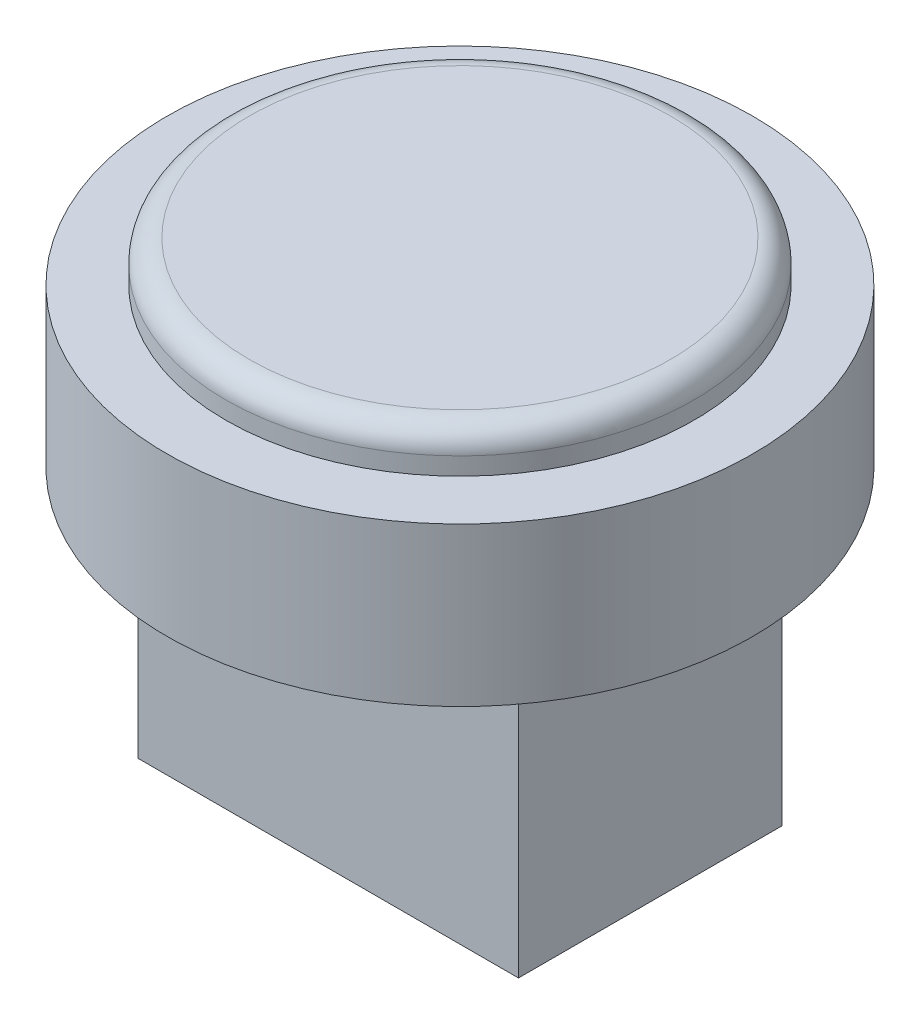
ISO-10303-21;
HEADER;
FILE_DESCRIPTION(('STEP AP214'),'2;1');
FILE_NAME('part.step','',(''),(''),'','','');
FILE_SCHEMA(('AUTOMOTIVE_DESIGN { 1 0 10303 214 1 1 1 1 }'));
ENDSEC;
DATA;
#1=APPLICATION_CONTEXT('core data for automotive mechanical design processes');
#2=APPLICATION_PROTOCOL_DEFINITION('international standard','automotive_design',2000,#1);
#3=PRODUCT_CONTEXT('',#1,'mechanical');
#4=PRODUCT('Part','Part','',(#3));
#5=PRODUCT_RELATED_PRODUCT_CATEGORY('part','',(#4));
#6=PRODUCT_DEFINITION_FORMATION('','',#4);
#7=PRODUCT_DEFINITION_CONTEXT('part definition',#1,'design');
#8=PRODUCT_DEFINITION('design','',#6,#7);
#9=PRODUCT_DEFINITION_SHAPE('','',#8);
#10=(LENGTH_UNIT() NAMED_UNIT(*) SI_UNIT(.MILLI.,.METRE.));
#11=(NAMED_UNIT(*) PLANE_ANGLE_UNIT() SI_UNIT($,.RADIAN.));
#12=(NAMED_UNIT(*) SI_UNIT($,.STERADIAN.) SOLID_ANGLE_UNIT());
#13=UNCERTAINTY_MEASURE_WITH_UNIT(LENGTH_MEASURE(1.E-05),#10,'distance_accuracy_value','');
#14=(GEOMETRIC_REPRESENTATION_CONTEXT(3) GLOBAL_UNCERTAINTY_ASSIGNED_CONTEXT((#13)) GLOBAL_UNIT_ASSIGNED_CONTEXT((#10,
#11,#12)) REPRESENTATION_CONTEXT('',''));
#15=CARTESIAN_POINT('',(0.,0.,0.));
#16=DIRECTION('',(0.,0.,1.));
#17=DIRECTION('',(1.,0.,0.));
#18=AXIS2_PLACEMENT_3D('',#15,#16,#17);
#19=CARTESIAN_POINT('',(0.,0.,0.));
#20=DIRECTION('',(0.,1.,0.));
#21=DIRECTION('',(0.,0.,1.));
#22=AXIS2_PLACEMENT_3D('',#19,#20,#21);
#23=PLANE('',#22);
#24=CARTESIAN_POINT('',(0.,0.,0.));
#25=DIRECTION('',(0.,1.,0.));
#26=DIRECTION('',(0.,0.,1.));
#27=AXIS2_PLACEMENT_3D('',#24,#25,#26);
#28=CIRCLE('',#27,5.);
#29=CARTESIAN_POINT('',(0.,0.,-5.));
#30=VERTEX_POINT('',#29);
#31=EDGE_CURVE('E100',#30,#30,#28,.T.);
#32=ORIENTED_EDGE('',*,*,#31,.F.);
#33=EDGE_LOOP('',(#32));
#34=FACE_BOUND('',#33,.T.);
#35=DIRECTION('',(0.,0.,-1.));
#36=VECTOR('',#35,1.);
#37=CARTESIAN_POINT('',(-3.25,0.,2.25));
#38=LINE('',#37,#36);
#39=CARTESIAN_POINT('',(-3.25,0.,2.25));
#40=VERTEX_POINT('',#39);
#41=CARTESIAN_POINT('',(-3.25,0.,-2.25));
#42=VERTEX_POINT('',#41);
#43=EDGE_CURVE('E96',#40,#42,#38,.T.);
#44=ORIENTED_EDGE('',*,*,#43,.F.);
#45=DIRECTION('',(-1.,0.,0.));
#46=VECTOR('',#45,1.);
#47=CARTESIAN_POINT('',(-3.25,0.,2.25));
#48=LINE('',#47,#46);
#49=CARTESIAN_POINT('',(3.25,0.,2.25));
#50=VERTEX_POINT('',#49);
#51=EDGE_CURVE('E93',#50,#40,#48,.T.);
#52=ORIENTED_EDGE('',*,*,#51,.F.);
#53=DIRECTION('',(0.,0.,1.));
#54=VECTOR('',#53,1.);
#55=CARTESIAN_POINT('',(3.25,0.,2.25));
#56=LINE('',#55,#54);
#57=CARTESIAN_POINT('',(3.25,0.,-2.25));
#58=VERTEX_POINT('',#57);
#59=EDGE_CURVE('E55',#58,#50,#56,.T.);
#60=ORIENTED_EDGE('',*,*,#59,.F.);
#61=DIRECTION('',(1.,0.,0.));
#62=VECTOR('',#61,1.);
#63=CARTESIAN_POINT('',(-3.25,0.,-2.25));
#64=LINE('',#63,#62);
#65=EDGE_CURVE('E50',#42,#58,#64,.T.);
#66=ORIENTED_EDGE('',*,*,#65,.F.);
#67=EDGE_LOOP('',(#44,#52,#60,#66));
#68=FACE_BOUND('',#67,.T.);
#69=ADVANCED_FACE('F35',(#34,#68),#23,.F.);
#70=CARTESIAN_POINT('',(0.,2.7,0.));
#71=DIRECTION('',(0.,1.,0.));
#72=DIRECTION('',(0.,0.,1.));
#73=AXIS2_PLACEMENT_3D('',#70,#71,#72);
#74=PLANE('',#73);
#75=CARTESIAN_POINT('',(0.,2.7,0.));
#76=DIRECTION('',(0.,1.,0.));
#77=DIRECTION('',(0.,0.,1.));
#78=AXIS2_PLACEMENT_3D('',#75,#76,#77);
#79=CIRCLE('',#78,5.);
#80=CARTESIAN_POINT('',(0.,2.7,-5.));
#81=VERTEX_POINT('',#80);
#82=EDGE_CURVE('E106',#81,#81,#79,.T.);
#83=ORIENTED_EDGE('',*,*,#82,.T.);
#84=EDGE_LOOP('',(#83));
#85=FACE_BOUND('',#84,.T.);
#86=CARTESIAN_POINT('',(0.,2.7,0.));
#87=DIRECTION('',(0.,1.,0.));
#88=DIRECTION('',(0.,0.,1.));
#89=AXIS2_PLACEMENT_3D('',#86,#87,#88);
#90=CIRCLE('',#89,4.);
#91=CARTESIAN_POINT('',(0.,2.7,4.));
#92=VERTEX_POINT('',#91);
#93=EDGE_CURVE('E97',#92,#92,#90,.T.);
#94=ORIENTED_EDGE('',*,*,#93,.F.);
#95=EDGE_LOOP('',(#94));
#96=FACE_BOUND('',#95,.T.);
#97=ADVANCED_FACE('F126',(#85,#96),#74,.T.);
#98=CARTESIAN_POINT('',(0.,2.7,0.));
#99=DIRECTION('',(0.,-1.,0.));
#100=DIRECTION('',(0.,0.,-1.));
#101=AXIS2_PLACEMENT_3D('',#98,#99,#100);
#102=CYLINDRICAL_SURFACE('',#101,5.);
#103=CARTESIAN_POINT('',(0.,2.7,-5.));
#104=CARTESIAN_POINT('',(0.,2.671875,-5.));
#105=CARTESIAN_POINT('',(0.,2.64375,-5.));
#106=CARTESIAN_POINT('',(0.,2.5875,-5.));
#107=CARTESIAN_POINT('',(0.,2.559375,-5.));
#108=CARTESIAN_POINT('',(0.,2.503125,-5.));
#109=CARTESIAN_POINT('',(0.,2.475,-5.));
#110=CARTESIAN_POINT('',(0.,2.41875,-5.));
#111=CARTESIAN_POINT('',(0.,2.390625,-5.));
#112=CARTESIAN_POINT('',(0.,2.334375,-5.));
#113=CARTESIAN_POINT('',(0.,2.30625,-5.));
#114=CARTESIAN_POINT('',(0.,2.25,-5.));
#115=CARTESIAN_POINT('',(0.,2.221875,-5.));
#116=CARTESIAN_POINT('',(0.,2.165625,-5.));
#117=CARTESIAN_POINT('',(0.,2.1375,-5.));
#118=CARTESIAN_POINT('',(0.,2.08125,-5.));
#119=CARTESIAN_POINT('',(0.,2.053125,-5.));
#120=CARTESIAN_POINT('',(0.,1.996875,-5.));
#121=CARTESIAN_POINT('',(0.,1.96875,-5.));
#122=CARTESIAN_POINT('',(0.,1.9125,-5.));
#123=CARTESIAN_POINT('',(0.,1.884375,-5.));
#124=CARTESIAN_POINT('',(0.,1.828125,-5.));
#125=CARTESIAN_POINT('',(0.,1.8,-5.));
#126=CARTESIAN_POINT('',(0.,1.74375,-5.));
#127=CARTESIAN_POINT('',(0.,1.715625,-5.));
#128=CARTESIAN_POINT('',(0.,1.659375,-5.));
#129=CARTESIAN_POINT('',(0.,1.63125,-5.));
#130=CARTESIAN_POINT('',(0.,1.575,-5.));
#131=CARTESIAN_POINT('',(0.,1.546875,-5.));
#132=CARTESIAN_POINT('',(0.,1.490625,-5.));
#133=CARTESIAN_POINT('',(0.,1.4625,-5.));
#134=CARTESIAN_POINT('',(0.,1.40625,-5.));
#135=CARTESIAN_POINT('',(0.,1.378125,-5.));
#136=CARTESIAN_POINT('',(0.,1.321875,-5.));
#137=CARTESIAN_POINT('',(0.,1.29375,-5.));
#138=CARTESIAN_POINT('',(0.,1.2375,-5.));
#139=CARTESIAN_POINT('',(0.,1.209375,-5.));
#140=CARTESIAN_POINT('',(0.,1.153125,-5.));
#141=CARTESIAN_POINT('',(0.,1.125,-5.));
#142=CARTESIAN_POINT('',(0.,1.06875,-5.));
#143=CARTESIAN_POINT('',(0.,1.040625,-5.));
#144=CARTESIAN_POINT('',(0.,0.984375,-5.));
#145=CARTESIAN_POINT('',(0.,0.95625,-5.));
#146=CARTESIAN_POINT('',(0.,0.9,-5.));
#147=CARTESIAN_POINT('',(0.,0.871875,-5.));
#148=CARTESIAN_POINT('',(0.,0.815625,-5.));
#149=CARTESIAN_POINT('',(0.,0.7875,-5.));
#150=CARTESIAN_POINT('',(0.,0.73125,-5.));
#151=CARTESIAN_POINT('',(0.,0.703125,-5.));
#152=CARTESIAN_POINT('',(0.,0.646875,-5.));
#153=CARTESIAN_POINT('',(0.,0.61875,-5.));
#154=CARTESIAN_POINT('',(0.,0.5625,-5.));
#155=CARTESIAN_POINT('',(0.,0.534375,-5.));
#156=CARTESIAN_POINT('',(0.,0.478125,-5.));
#157=CARTESIAN_POINT('',(0.,0.45,-5.));
#158=CARTESIAN_POINT('',(0.,0.39375,-5.));
#159=CARTESIAN_POINT('',(0.,0.365625,-5.));
#160=CARTESIAN_POINT('',(0.,0.309375,-5.));
#161=CARTESIAN_POINT('',(0.,0.28125,-5.));
#162=CARTESIAN_POINT('',(0.,0.225,-5.));
#163=CARTESIAN_POINT('',(0.,0.196875,-5.));
#164=CARTESIAN_POINT('',(0.,0.140625,-5.));
#165=CARTESIAN_POINT('',(0.,0.112499999999999,-5.));
#166=CARTESIAN_POINT('',(0.,0.0562499999999994,-5.));
#167=CARTESIAN_POINT('',(0.,0.0281249999999995,-5.));
#168=CARTESIAN_POINT('',(0.,0.,-5.));
#169=B_SPLINE_CURVE_WITH_KNOTS('',3,(#103,#104,#105,#106,#107,#108,#109,#110,#111,#112,#113,
#114,#115,#116,#117,#118,#119,#120,#121,#122,#123,#124,#125,#126,#127,#128,#129,#130,#131,#132,
#133,#134,#135,#136,#137,#138,#139,#140,#141,#142,#143,#144,#145,#146,#147,#148,#149,#150,#151,
#152,#153,#154,#155,#156,#157,#158,#159,#160,#161,#162,#163,#164,#165,#166,#167,#168),
.UNSPECIFIED.,.F.,.F.,(4,2,2,2,2,2,2,2,2,2,2,2,2,2,2,2,2,2,2,2,2,2,2,2,2,2,2,2,2,2,2,2,4),(0.,
0.0843749999999998,0.16875,0.253125,0.3375,0.421875,0.50625,0.590625,0.675,0.759375,0.84375,
0.928125,1.0125,1.096875,1.18125,1.265625,1.35,1.434375,1.51875,1.603125,1.6875,1.771875,
1.85625,1.940625,2.025,2.109375,2.19375,2.278125,2.3625,2.446875,2.53125,2.615625,2.7),.UNSPECIFIED.);
#170=EDGE_CURVE('BSEAM132',#81,#30,#169,.T.);
#171=ORIENTED_EDGE('',*,*,#82,.F.);
#172=ORIENTED_EDGE('',*,*,#31,.T.);
#173=ORIENTED_EDGE('',*,*,#170,.T.);
#174=ORIENTED_EDGE('',*,*,#170,.F.);
#175=EDGE_LOOP('',(#171,#173,#172,#174));
#176=FACE_BOUND('',#175,.T.);
#177=ADVANCED_FACE('F132',(#176),#102,.T.);
#178=CARTESIAN_POINT('',(0.,3.4,0.));
#179=DIRECTION('',(0.,-1.,0.));
#180=DIRECTION('',(0.,0.,-1.));
#181=AXIS2_PLACEMENT_3D('',#178,#179,#180);
#182=CYLINDRICAL_SURFACE('',#181,4.);
#183=CARTESIAN_POINT('',(0.,3.,0.));
#184=DIRECTION('',(0.,1.,0.));
#185=DIRECTION('',(0.,0.,1.));
#186=AXIS2_PLACEMENT_3D('',#183,#184,#185);
#187=CIRCLE('',#186,4.);
#188=CARTESIAN_POINT('',(0.,3.,4.));
#189=VERTEX_POINT('',#188);
#190=EDGE_CURVE('E11',#189,#189,#187,.F.);
#191=ORIENTED_EDGE('',*,*,#190,.T.);
#192=EDGE_LOOP('',(#191));
#193=FACE_BOUND('',#192,.T.);
#194=ORIENTED_EDGE('',*,*,#93,.T.);
#195=EDGE_LOOP('',(#194));
#196=FACE_BOUND('',#195,.T.);
#197=ADVANCED_FACE('F122',(#193,#196),#182,.T.);
#198=CARTESIAN_POINT('',(0.,3.4,0.));
#199=DIRECTION('',(0.,1.,0.));
#200=DIRECTION('',(0.,0.,1.));
#201=AXIS2_PLACEMENT_3D('',#198,#199,#200);
#202=PLANE('',#201);
#203=CARTESIAN_POINT('',(0.,3.4,0.));
#204=DIRECTION('',(0.,1.,0.));
#205=DIRECTION('',(0.,0.,1.));
#206=AXIS2_PLACEMENT_3D('',#203,#204,#205);
#207=CIRCLE('',#206,3.6);
#208=CARTESIAN_POINT('',(0.,3.4,3.6));
#209=VERTEX_POINT('',#208);
#210=EDGE_CURVE('E43',#209,#209,#207,.T.);
#211=ORIENTED_EDGE('',*,*,#210,.T.);
#212=EDGE_LOOP('',(#211));
#213=FACE_BOUND('',#212,.T.);
#214=ADVANCED_FACE('F113',(#213),#202,.T.);
#215=CARTESIAN_POINT('',(0.,3.,0.));
#216=DIRECTION('',(0.,1.,0.));
#217=DIRECTION('',(0.,0.,1.));
#218=AXIS2_PLACEMENT_3D('',#215,#216,#217);
#219=TOROIDAL_SURFACE('',#218,3.6,0.4);
#220=ORIENTED_EDGE('',*,*,#190,.F.);
#221=EDGE_LOOP('',(#220));
#222=FACE_BOUND('',#221,.T.);
#223=ORIENTED_EDGE('',*,*,#210,.F.);
#224=EDGE_LOOP('',(#223));
#225=FACE_BOUND('',#224,.T.);
#226=ADVANCED_FACE('F37',(#222,#225),#219,.T.);
#227=CARTESIAN_POINT('',(-3.25,-4.8,2.25));
#228=DIRECTION('',(1.,0.,0.));
#229=DIRECTION('',(0.,0.,-1.));
#230=AXIS2_PLACEMENT_3D('',#227,#228,#229);
#231=PLANE('',#230);
#232=ORIENTED_EDGE('',*,*,#43,.T.);
#233=DIRECTION('',(0.,1.,0.));
#234=VECTOR('',#233,1.);
#235=CARTESIAN_POINT('',(-3.25,-4.8,-2.25));
#236=LINE('',#235,#234);
#237=CARTESIAN_POINT('',(-3.25,-4.8,-2.25));
#238=VERTEX_POINT('',#237);
#239=EDGE_CURVE('E77',#238,#42,#236,.T.);
#240=ORIENTED_EDGE('',*,*,#239,.F.);
#241=DIRECTION('',(0.,0.,-1.));
#242=VECTOR('',#241,1.);
#243=CARTESIAN_POINT('',(-3.25,-4.8,2.25));
#244=LINE('',#243,#242);
#245=CARTESIAN_POINT('',(-3.25,-4.8,2.25));
#246=VERTEX_POINT('',#245);
#247=EDGE_CURVE('E84',#246,#238,#244,.T.);
#248=ORIENTED_EDGE('',*,*,#247,.F.);
#249=DIRECTION('',(0.,1.,0.));
#250=VECTOR('',#249,1.);
#251=CARTESIAN_POINT('',(-3.25,-4.8,2.25));
#252=LINE('',#251,#250);
#253=EDGE_CURVE('E228',#246,#40,#252,.T.);
#254=ORIENTED_EDGE('',*,*,#253,.T.);
#255=EDGE_LOOP('',(#232,#240,#248,#254));
#256=FACE_BOUND('',#255,.T.);
#257=ADVANCED_FACE('F95',(#256),#231,.F.);
#258=CARTESIAN_POINT('',(-3.25,-4.8,-2.25));
#259=DIRECTION('',(0.,0.,1.));
#260=DIRECTION('',(1.,0.,0.));
#261=AXIS2_PLACEMENT_3D('',#258,#259,#260);
#262=PLANE('',#261);
#263=ORIENTED_EDGE('',*,*,#65,.T.);
#264=DIRECTION('',(0.,1.,0.));
#265=VECTOR('',#264,1.);
#266=CARTESIAN_POINT('',(3.25,-4.8,-2.25));
#267=LINE('',#266,#265);
#268=CARTESIAN_POINT('',(3.25,-4.8,-2.25));
#269=VERTEX_POINT('',#268);
#270=EDGE_CURVE('E80',#269,#58,#267,.T.);
#271=ORIENTED_EDGE('',*,*,#270,.F.);
#272=DIRECTION('',(1.,0.,0.));
#273=VECTOR('',#272,1.);
#274=CARTESIAN_POINT('',(-3.25,-4.8,-2.25));
#275=LINE('',#274,#273);
#276=EDGE_CURVE('E73',#238,#269,#275,.T.);
#277=ORIENTED_EDGE('',*,*,#276,.F.);
#278=ORIENTED_EDGE('',*,*,#239,.T.);
#279=EDGE_LOOP('',(#263,#271,#277,#278));
#280=FACE_BOUND('',#279,.T.);
#281=ADVANCED_FACE('F75',(#280),#262,.F.);
#282=CARTESIAN_POINT('',(3.25,-4.8,2.25));
#283=DIRECTION('',(-1.,0.,0.));
#284=DIRECTION('',(0.,0.,1.));
#285=AXIS2_PLACEMENT_3D('',#282,#283,#284);
#286=PLANE('',#285);
#287=ORIENTED_EDGE('',*,*,#59,.T.);
#288=DIRECTION('',(0.,1.,0.));
#289=VECTOR('',#288,1.);
#290=CARTESIAN_POINT('',(3.25,-4.8,2.25));
#291=LINE('',#290,#289);
#292=CARTESIAN_POINT('',(3.25,-4.8,2.25));
#293=VERTEX_POINT('',#292);
#294=EDGE_CURVE('E102',#293,#50,#291,.T.);
#295=ORIENTED_EDGE('',*,*,#294,.F.);
#296=DIRECTION('',(0.,0.,1.));
#297=VECTOR('',#296,1.);
#298=CARTESIAN_POINT('',(3.25,-4.8,2.25));
#299=LINE('',#298,#297);
#300=EDGE_CURVE('E83',#269,#293,#299,.T.);
#301=ORIENTED_EDGE('',*,*,#300,.F.);
#302=ORIENTED_EDGE('',*,*,#270,.T.);
#303=EDGE_LOOP('',(#287,#295,#301,#302));
#304=FACE_BOUND('',#303,.T.);
#305=ADVANCED_FACE('F153',(#304),#286,.F.);
#306=CARTESIAN_POINT('',(-3.25,-4.8,2.25));
#307=DIRECTION('',(0.,0.,-1.));
#308=DIRECTION('',(-1.,0.,0.));
#309=AXIS2_PLACEMENT_3D('',#306,#307,#308);
#310=PLANE('',#309);
#311=ORIENTED_EDGE('',*,*,#51,.T.);
#312=ORIENTED_EDGE('',*,*,#253,.F.);
#313=DIRECTION('',(-1.,0.,0.));
#314=VECTOR('',#313,1.);
#315=CARTESIAN_POINT('',(-3.25,-4.8,2.25));
#316=LINE('',#315,#314);
#317=EDGE_CURVE('E89',#293,#246,#316,.T.);
#318=ORIENTED_EDGE('',*,*,#317,.F.);
#319=ORIENTED_EDGE('',*,*,#294,.T.);
#320=EDGE_LOOP('',(#311,#312,#318,#319));
#321=FACE_BOUND('',#320,.T.);
#322=ADVANCED_FACE('F156',(#321),#310,.F.);
#323=CARTESIAN_POINT('',(0.,-4.8,0.));
#324=DIRECTION('',(0.,-1.,0.));
#325=DIRECTION('',(0.,0.,-1.));
#326=AXIS2_PLACEMENT_3D('',#323,#324,#325);
#327=PLANE('',#326);
#328=ORIENTED_EDGE('',*,*,#247,.T.);
#329=ORIENTED_EDGE('',*,*,#276,.T.);
#330=ORIENTED_EDGE('',*,*,#300,.T.);
#331=ORIENTED_EDGE('',*,*,#317,.T.);
#332=EDGE_LOOP('',(#328,#329,#330,#331));
#333=FACE_BOUND('',#332,.T.);
#334=ADVANCED_FACE('F87',(#333),#327,.T.);
#335=CLOSED_SHELL('',(#69,#97,#177,#197,#214,#226,#257,#281,#305,#322,#334));
#336=MANIFOLD_SOLID_BREP('B2',#335);
#337=ADVANCED_BREP_SHAPE_REPRESENTATION('',(#18,#336),#14);
#338=SHAPE_DEFINITION_REPRESENTATION(#9,#337);
ENDSEC;
END-ISO-10303-21;
